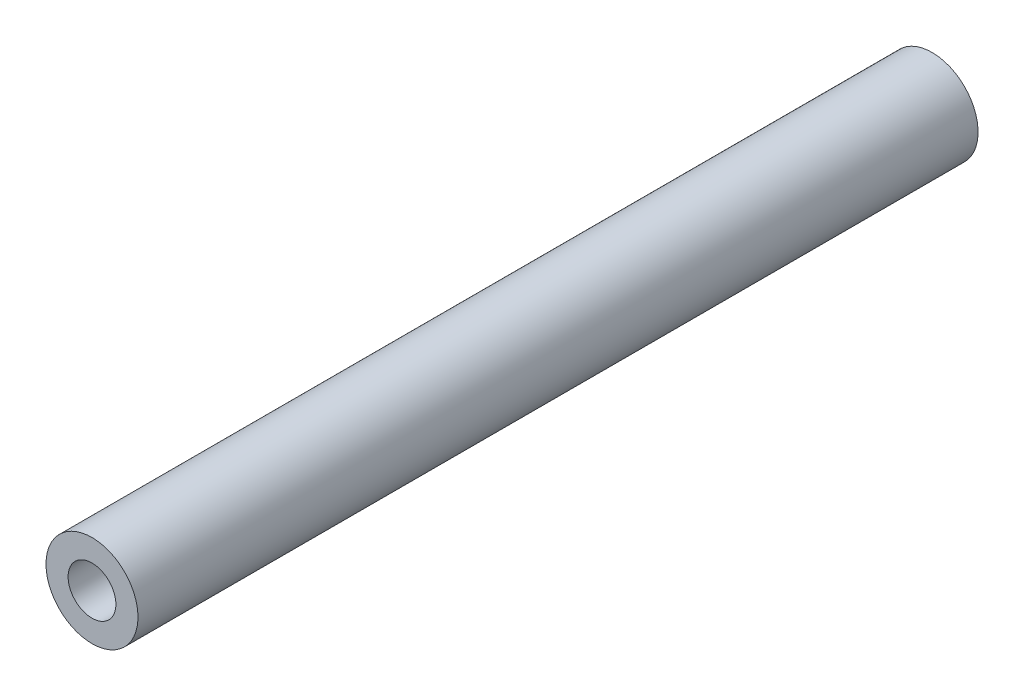
ISO-10303-21;
HEADER;
FILE_DESCRIPTION(('STEP AP214'),'2;1');
FILE_NAME('part.step','',(''),(''),'','','');
FILE_SCHEMA(('AUTOMOTIVE_DESIGN { 1 0 10303 214 1 1 1 1 }'));
ENDSEC;
DATA;
#1=APPLICATION_CONTEXT('core data for automotive mechanical design processes');
#2=APPLICATION_PROTOCOL_DEFINITION('international standard','automotive_design',2000,#1);
#3=PRODUCT_CONTEXT('',#1,'mechanical');
#4=PRODUCT('Part','Part','',(#3));
#5=PRODUCT_RELATED_PRODUCT_CATEGORY('part','',(#4));
#6=PRODUCT_DEFINITION_FORMATION('','',#4);
#7=PRODUCT_DEFINITION_CONTEXT('part definition',#1,'design');
#8=PRODUCT_DEFINITION('design','',#6,#7);
#9=PRODUCT_DEFINITION_SHAPE('','',#8);
#10=(LENGTH_UNIT() NAMED_UNIT(*) SI_UNIT(.MILLI.,.METRE.));
#11=(NAMED_UNIT(*) PLANE_ANGLE_UNIT() SI_UNIT($,.RADIAN.));
#12=(NAMED_UNIT(*) SI_UNIT($,.STERADIAN.) SOLID_ANGLE_UNIT());
#13=UNCERTAINTY_MEASURE_WITH_UNIT(LENGTH_MEASURE(1.E-05),#10,'distance_accuracy_value','');
#14=(GEOMETRIC_REPRESENTATION_CONTEXT(3) GLOBAL_UNCERTAINTY_ASSIGNED_CONTEXT((#13)) GLOBAL_UNIT_ASSIGNED_CONTEXT((#10,
#11,#12)) REPRESENTATION_CONTEXT('',''));
#15=CARTESIAN_POINT('',(0.,0.,0.));
#16=DIRECTION('',(0.,0.,1.));
#17=DIRECTION('',(1.,0.,0.));
#18=AXIS2_PLACEMENT_3D('',#15,#16,#17);
#19=CARTESIAN_POINT('',(0.,0.,29.));
#20=DIRECTION('',(0.,0.,-1.));
#21=DIRECTION('',(-1.,0.,0.));
#22=AXIS2_PLACEMENT_3D('',#19,#20,#21);
#23=CYLINDRICAL_SURFACE('',#22,3.175);
#24=CARTESIAN_POINT('',(0.,0.,29.));
#25=DIRECTION('',(0.,0.,1.));
#26=DIRECTION('',(1.,0.,0.));
#27=AXIS2_PLACEMENT_3D('',#24,#25,#26);
#28=CIRCLE('',#27,3.175);
#29=CARTESIAN_POINT('',(-3.175,0.,29.));
#30=VERTEX_POINT('',#29);
#31=EDGE_CURVE('E11',#30,#30,#28,.T.);
#32=CARTESIAN_POINT('',(0.,0.,-29.));
#33=DIRECTION('',(0.,0.,1.));
#34=DIRECTION('',(1.,0.,0.));
#35=AXIS2_PLACEMENT_3D('',#32,#33,#34);
#36=CIRCLE('',#35,3.175);
#37=CARTESIAN_POINT('',(-3.175,0.,-29.));
#38=VERTEX_POINT('',#37);
#39=EDGE_CURVE('E42',#38,#38,#36,.T.);
#40=CARTESIAN_POINT('',(-3.175,0.,29.));
#41=CARTESIAN_POINT('',(-3.175,0.,28.3958333333333));
#42=CARTESIAN_POINT('',(-3.175,0.,27.7916666666667));
#43=CARTESIAN_POINT('',(-3.175,0.,26.5833333333333));
#44=CARTESIAN_POINT('',(-3.175,0.,25.9791666666667));
#45=CARTESIAN_POINT('',(-3.175,0.,24.7708333333333));
#46=CARTESIAN_POINT('',(-3.175,0.,24.1666666666667));
#47=CARTESIAN_POINT('',(-3.175,0.,22.9583333333333));
#48=CARTESIAN_POINT('',(-3.175,0.,22.3541666666667));
#49=CARTESIAN_POINT('',(-3.175,0.,21.1458333333333));
#50=CARTESIAN_POINT('',(-3.175,0.,20.5416666666667));
#51=CARTESIAN_POINT('',(-3.175,0.,19.3333333333333));
#52=CARTESIAN_POINT('',(-3.175,0.,18.7291666666667));
#53=CARTESIAN_POINT('',(-3.175,0.,17.5208333333333));
#54=CARTESIAN_POINT('',(-3.175,0.,16.9166666666667));
#55=CARTESIAN_POINT('',(-3.175,0.,15.7083333333333));
#56=CARTESIAN_POINT('',(-3.175,0.,15.1041666666667));
#57=CARTESIAN_POINT('',(-3.175,0.,13.8958333333333));
#58=CARTESIAN_POINT('',(-3.175,0.,13.2916666666667));
#59=CARTESIAN_POINT('',(-3.175,0.,12.0833333333333));
#60=CARTESIAN_POINT('',(-3.175,0.,11.4791666666667));
#61=CARTESIAN_POINT('',(-3.175,0.,10.2708333333333));
#62=CARTESIAN_POINT('',(-3.175,0.,9.66666666666667));
#63=CARTESIAN_POINT('',(-3.175,0.,8.45833333333333));
#64=CARTESIAN_POINT('',(-3.175,0.,7.85416666666666));
#65=CARTESIAN_POINT('',(-3.175,0.,6.64583333333333));
#66=CARTESIAN_POINT('',(-3.175,0.,6.04166666666666));
#67=CARTESIAN_POINT('',(-3.175,0.,4.83333333333333));
#68=CARTESIAN_POINT('',(-3.175,0.,4.22916666666666));
#69=CARTESIAN_POINT('',(-3.175,0.,3.02083333333333));
#70=CARTESIAN_POINT('',(-3.175,0.,2.41666666666666));
#71=CARTESIAN_POINT('',(-3.175,0.,1.20833333333333));
#72=CARTESIAN_POINT('',(-3.175,0.,0.604166666666664));
#73=CARTESIAN_POINT('',(-3.175,0.,-0.604166666666671));
#74=CARTESIAN_POINT('',(-3.175,0.,-1.20833333333334));
#75=CARTESIAN_POINT('',(-3.175,0.,-2.41666666666667));
#76=CARTESIAN_POINT('',(-3.175,0.,-3.02083333333333));
#77=CARTESIAN_POINT('',(-3.175,0.,-4.22916666666667));
#78=CARTESIAN_POINT('',(-3.175,0.,-4.83333333333333));
#79=CARTESIAN_POINT('',(-3.175,0.,-6.04166666666666));
#80=CARTESIAN_POINT('',(-3.175,0.,-6.64583333333333));
#81=CARTESIAN_POINT('',(-3.175,0.,-7.85416666666666));
#82=CARTESIAN_POINT('',(-3.175,0.,-8.45833333333333));
#83=CARTESIAN_POINT('',(-3.175,0.,-9.66666666666667));
#84=CARTESIAN_POINT('',(-3.175,0.,-10.2708333333333));
#85=CARTESIAN_POINT('',(-3.175,0.,-11.4791666666667));
#86=CARTESIAN_POINT('',(-3.175,0.,-12.0833333333333));
#87=CARTESIAN_POINT('',(-3.175,0.,-13.2916666666667));
#88=CARTESIAN_POINT('',(-3.175,0.,-13.8958333333333));
#89=CARTESIAN_POINT('',(-3.175,0.,-15.1041666666667));
#90=CARTESIAN_POINT('',(-3.175,0.,-15.7083333333333));
#91=CARTESIAN_POINT('',(-3.175,0.,-16.9166666666667));
#92=CARTESIAN_POINT('',(-3.175,0.,-17.5208333333333));
#93=CARTESIAN_POINT('',(-3.175,0.,-18.7291666666667));
#94=CARTESIAN_POINT('',(-3.175,0.,-19.3333333333333));
#95=CARTESIAN_POINT('',(-3.175,0.,-20.5416666666667));
#96=CARTESIAN_POINT('',(-3.175,0.,-21.1458333333333));
#97=CARTESIAN_POINT('',(-3.175,0.,-22.3541666666667));
#98=CARTESIAN_POINT('',(-3.175,0.,-22.9583333333333));
#99=CARTESIAN_POINT('',(-3.175,0.,-24.1666666666667));
#100=CARTESIAN_POINT('',(-3.175,0.,-24.7708333333333));
#101=CARTESIAN_POINT('',(-3.175,0.,-25.9791666666667));
#102=CARTESIAN_POINT('',(-3.175,0.,-26.5833333333333));
#103=CARTESIAN_POINT('',(-3.175,0.,-27.7916666666667));
#104=CARTESIAN_POINT('',(-3.175,0.,-28.3958333333333));
#105=CARTESIAN_POINT('',(-3.175,0.,-29.));
#106=B_SPLINE_CURVE_WITH_KNOTS('',3,(#40,#41,#42,#43,#44,#45,#46,#47,#48,#49,#50,#51,#52,#53,
#54,#55,#56,#57,#58,#59,#60,#61,#62,#63,#64,#65,#66,#67,#68,#69,#70,#71,#72,#73,#74,#75,#76,#77,
#78,#79,#80,#81,#82,#83,#84,#85,#86,#87,#88,#89,#90,#91,#92,#93,#94,#95,#96,#97,#98,#99,#100,
#101,#102,#103,#104,#105),.UNSPECIFIED.,.F.,.F.,(4,2,2,2,2,2,2,2,2,2,2,2,2,2,2,2,2,2,2,2,2,2,2,
2,2,2,2,2,2,2,2,2,4),(0.,1.8125,3.625,5.4375,7.25,9.0625,10.875,12.6875,14.5,16.3125,18.125,
19.9375,21.75,23.5625,25.375,27.1875,29.,30.8125,32.625,34.4375,36.25,38.0625,39.875,41.6875,
43.5,45.3125,47.125,48.9375,50.75,52.5625,54.375,56.1875,58.),.UNSPECIFIED.);
#107=EDGE_CURVE('BSEAM39',#30,#38,#106,.T.);
#108=ORIENTED_EDGE('',*,*,#31,.F.);
#109=ORIENTED_EDGE('',*,*,#39,.T.);
#110=ORIENTED_EDGE('',*,*,#107,.T.);
#111=ORIENTED_EDGE('',*,*,#107,.F.);
#112=EDGE_LOOP('',(#108,#110,#109,#111));
#113=FACE_BOUND('',#112,.T.);
#114=ADVANCED_FACE('F39',(#113),#23,.T.);
#115=CARTESIAN_POINT('',(0.,0.,29.));
#116=DIRECTION('',(0.,0.,1.));
#117=DIRECTION('',(1.,0.,0.));
#118=AXIS2_PLACEMENT_3D('',#115,#116,#117);
#119=PLANE('',#118);
#120=CARTESIAN_POINT('',(0.,0.,29.));
#121=DIRECTION('',(0.,0.,1.));
#122=DIRECTION('',(1.,0.,0.));
#123=AXIS2_PLACEMENT_3D('',#120,#121,#122);
#124=CIRCLE('',#123,1.64999999999999);
#125=CARTESIAN_POINT('',(1.64999999999999,0.,29.));
#126=VERTEX_POINT('',#125);
#127=EDGE_CURVE('E62',#126,#126,#124,.T.);
#128=ORIENTED_EDGE('',*,*,#127,.F.);
#129=EDGE_LOOP('',(#128));
#130=FACE_BOUND('',#129,.T.);
#131=ORIENTED_EDGE('',*,*,#31,.T.);
#132=EDGE_LOOP('',(#131));
#133=FACE_BOUND('',#132,.T.);
#134=ADVANCED_FACE('F81',(#130,#133),#119,.T.);
#135=CARTESIAN_POINT('',(0.,0.,-29.));
#136=DIRECTION('',(0.,0.,1.));
#137=DIRECTION('',(1.,0.,0.));
#138=AXIS2_PLACEMENT_3D('',#135,#136,#137);
#139=PLANE('',#138);
#140=CARTESIAN_POINT('',(0.,0.,-29.));
#141=DIRECTION('',(0.,0.,-1.));
#142=DIRECTION('',(-1.,0.,0.));
#143=AXIS2_PLACEMENT_3D('',#140,#141,#142);
#144=CIRCLE('',#143,1.64999999999999);
#145=CARTESIAN_POINT('',(-1.64999999999999,0.,-29.));
#146=VERTEX_POINT('',#145);
#147=EDGE_CURVE('E63',#146,#146,#144,.T.);
#148=ORIENTED_EDGE('',*,*,#147,.F.);
#149=EDGE_LOOP('',(#148));
#150=FACE_BOUND('',#149,.T.);
#151=ORIENTED_EDGE('',*,*,#39,.F.);
#152=EDGE_LOOP('',(#151));
#153=FACE_BOUND('',#152,.T.);
#154=ADVANCED_FACE('F78',(#150,#153),#139,.F.);
#155=CARTESIAN_POINT('',(0.,0.,11.982));
#156=DIRECTION('',(0.,0.,1.));
#157=DIRECTION('',(1.,0.,0.));
#158=AXIS2_PLACEMENT_3D('',#155,#156,#157);
#159=CONICAL_SURFACE('',#158,1.64999999999999,1.02974425867665);
#160=CARTESIAN_POINT('',(0.,0.,10.9905799786045));
#161=VERTEX_POINT('',#160);
#162=VERTEX_LOOP('',#161);
#163=FACE_BOUND('',#162,.T.);
#164=CARTESIAN_POINT('',(0.,0.,11.982));
#165=DIRECTION('',(0.,0.,1.));
#166=DIRECTION('',(1.,0.,0.));
#167=AXIS2_PLACEMENT_3D('',#164,#165,#166);
#168=CIRCLE('',#167,1.64999999999999);
#169=CARTESIAN_POINT('',(1.64999999999999,0.,11.982));
#170=VERTEX_POINT('',#169);
#171=EDGE_CURVE('E66',#170,#170,#168,.T.);
#172=ORIENTED_EDGE('',*,*,#171,.T.);
#173=EDGE_LOOP('',(#172));
#174=FACE_BOUND('',#173,.T.);
#175=ADVANCED_FACE('F80',(#163,#174),#159,.F.);
#176=CARTESIAN_POINT('',(0.,0.,29.));
#177=DIRECTION('',(0.,0.,1.));
#178=DIRECTION('',(1.,0.,0.));
#179=AXIS2_PLACEMENT_3D('',#176,#177,#178);
#180=CYLINDRICAL_SURFACE('',#179,1.64999999999999);
#181=ORIENTED_EDGE('',*,*,#171,.F.);
#182=EDGE_LOOP('',(#181));
#183=FACE_BOUND('',#182,.T.);
#184=ORIENTED_EDGE('',*,*,#127,.T.);
#185=EDGE_LOOP('',(#184));
#186=FACE_BOUND('',#185,.T.);
#187=ADVANCED_FACE('F56',(#183,#186),#180,.F.);
#188=CARTESIAN_POINT('',(0.,0.,-11.982));
#189=DIRECTION('',(0.,0.,-1.));
#190=DIRECTION('',(-1.,0.,0.));
#191=AXIS2_PLACEMENT_3D('',#188,#189,#190);
#192=CONICAL_SURFACE('',#191,1.64999999999999,1.02974425867665);
#193=CARTESIAN_POINT('',(0.,0.,-10.9905799786045));
#194=VERTEX_POINT('',#193);
#195=VERTEX_LOOP('',#194);
#196=FACE_BOUND('',#195,.T.);
#197=CARTESIAN_POINT('',(0.,0.,-11.982));
#198=DIRECTION('',(0.,0.,-1.));
#199=DIRECTION('',(-1.,0.,0.));
#200=AXIS2_PLACEMENT_3D('',#197,#198,#199);
#201=CIRCLE('',#200,1.64999999999999);
#202=CARTESIAN_POINT('',(-1.64999999999999,0.,-11.982));
#203=VERTEX_POINT('',#202);
#204=EDGE_CURVE('E60',#203,#203,#201,.T.);
#205=ORIENTED_EDGE('',*,*,#204,.T.);
#206=EDGE_LOOP('',(#205));
#207=FACE_BOUND('',#206,.T.);
#208=ADVANCED_FACE('F52',(#196,#207),#192,.F.);
#209=CARTESIAN_POINT('',(0.,0.,-29.));
#210=DIRECTION('',(0.,0.,-1.));
#211=DIRECTION('',(-1.,0.,0.));
#212=AXIS2_PLACEMENT_3D('',#209,#210,#211);
#213=CYLINDRICAL_SURFACE('',#212,1.64999999999999);
#214=ORIENTED_EDGE('',*,*,#204,.F.);
#215=EDGE_LOOP('',(#214));
#216=FACE_BOUND('',#215,.T.);
#217=ORIENTED_EDGE('',*,*,#147,.T.);
#218=EDGE_LOOP('',(#217));
#219=FACE_BOUND('',#218,.T.);
#220=ADVANCED_FACE('F55',(#216,#219),#213,.F.);
#221=CLOSED_SHELL('',(#114,#134,#154,#175,#187,#208,#220));
#222=MANIFOLD_SOLID_BREP('B2',#221);
#223=ADVANCED_BREP_SHAPE_REPRESENTATION('',(#18,#222),#14);
#224=SHAPE_DEFINITION_REPRESENTATION(#9,#223);
ENDSEC;
END-ISO-10303-21;
